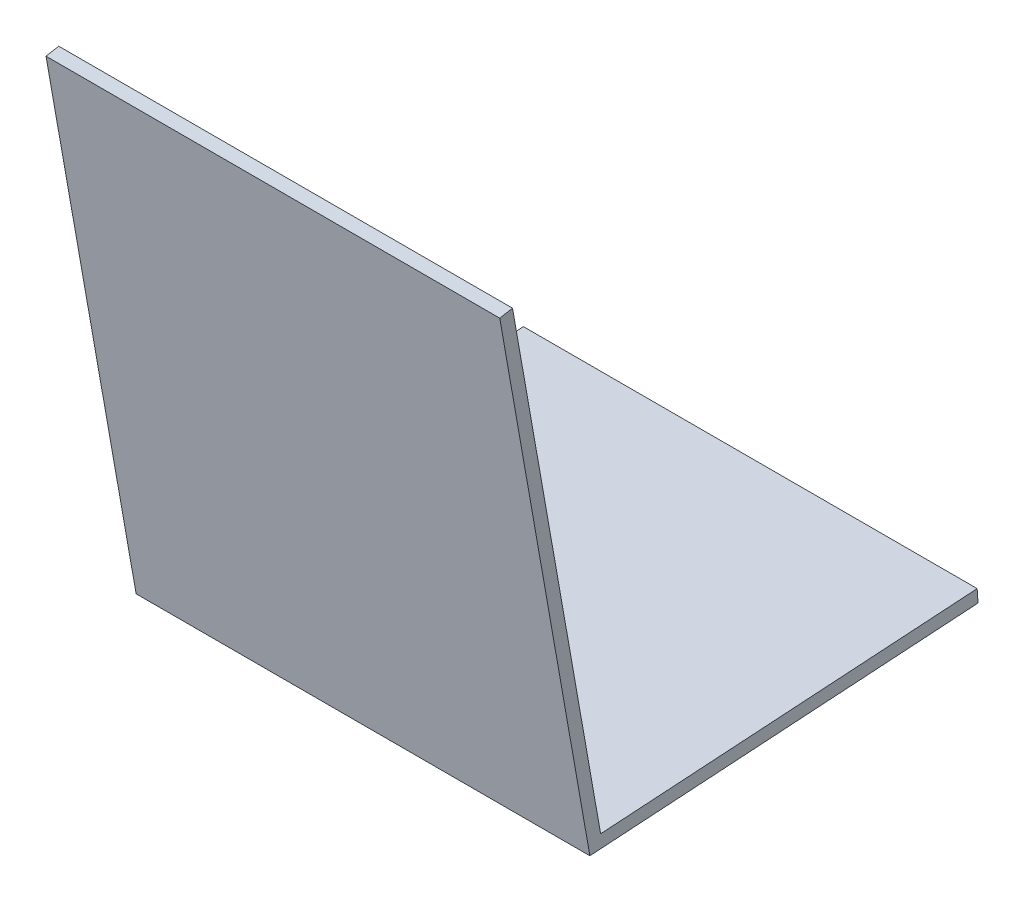
ISO-10303-21;
HEADER;
FILE_DESCRIPTION(('STEP AP214'),'2;1');
FILE_NAME('part.step','',(''),(''),'','','');
FILE_SCHEMA(('AUTOMOTIVE_DESIGN { 1 0 10303 214 1 1 1 1 }'));
ENDSEC;
DATA;
#1=APPLICATION_CONTEXT('core data for automotive mechanical design processes');
#2=APPLICATION_PROTOCOL_DEFINITION('international standard','automotive_design',2000,#1);
#3=PRODUCT_CONTEXT('',#1,'mechanical');
#4=PRODUCT('Part','Part','',(#3));
#5=PRODUCT_RELATED_PRODUCT_CATEGORY('part','',(#4));
#6=PRODUCT_DEFINITION_FORMATION('','',#4);
#7=PRODUCT_DEFINITION_CONTEXT('part definition',#1,'design');
#8=PRODUCT_DEFINITION('design','',#6,#7);
#9=PRODUCT_DEFINITION_SHAPE('','',#8);
#10=(LENGTH_UNIT() NAMED_UNIT(*) SI_UNIT(.MILLI.,.METRE.));
#11=(NAMED_UNIT(*) PLANE_ANGLE_UNIT() SI_UNIT($,.RADIAN.));
#12=(NAMED_UNIT(*) SI_UNIT($,.STERADIAN.) SOLID_ANGLE_UNIT());
#13=UNCERTAINTY_MEASURE_WITH_UNIT(LENGTH_MEASURE(1.E-05),#10,'distance_accuracy_value','');
#14=(GEOMETRIC_REPRESENTATION_CONTEXT(3) GLOBAL_UNCERTAINTY_ASSIGNED_CONTEXT((#13)) GLOBAL_UNIT_ASSIGNED_CONTEXT((#10,
#11,#12)) REPRESENTATION_CONTEXT('',''));
#15=CARTESIAN_POINT('',(0.,0.,0.));
#16=DIRECTION('',(0.,0.,1.));
#17=DIRECTION('',(1.,0.,0.));
#18=AXIS2_PLACEMENT_3D('',#15,#16,#17);
#19=CARTESIAN_POINT('',(175.,406.613423527175,923.912107866843));
#20=DIRECTION('',(0.,-0.984783558817937,-0.173785333909049));
#21=DIRECTION('',(0.,0.173785333909049,-0.984783558817937));
#22=AXIS2_PLACEMENT_3D('',#19,#20,#21);
#23=PLANE('',#22);
#24=DIRECTION('',(0.,-0.173785333909049,0.984783558817937));
#25=VECTOR('',#24,1.);
#26=CARTESIAN_POINT('',(-175.,406.613423527175,923.912107866843));
#27=LINE('',#26,#25);
#28=CARTESIAN_POINT('',(-175.,408.351276866265,914.064272278663));
#29=VERTEX_POINT('',#28);
#30=CARTESIAN_POINT('',(-175.,406.613423527175,923.912107866843));
#31=VERTEX_POINT('',#30);
#32=EDGE_CURVE('E123',#29,#31,#27,.T.);
#33=ORIENTED_EDGE('',*,*,#32,.T.);
#34=DIRECTION('',(-1.,0.,0.));
#35=VECTOR('',#34,1.);
#36=CARTESIAN_POINT('',(175.,406.613423527175,923.912107866843));
#37=LINE('',#36,#35);
#38=CARTESIAN_POINT('',(175.,406.613423527175,923.912107866843));
#39=VERTEX_POINT('',#38);
#40=EDGE_CURVE('E11',#39,#31,#37,.T.);
#41=ORIENTED_EDGE('',*,*,#40,.F.);
#42=DIRECTION('',(0.,-0.173785333909049,0.984783558817937));
#43=VECTOR('',#42,1.);
#44=CARTESIAN_POINT('',(175.,406.613423527175,923.912107866843));
#45=LINE('',#44,#43);
#46=CARTESIAN_POINT('',(175.,408.351276866265,914.064272278663));
#47=VERTEX_POINT('',#46);
#48=EDGE_CURVE('E133',#47,#39,#45,.T.);
#49=ORIENTED_EDGE('',*,*,#48,.F.);
#50=DIRECTION('',(-1.,0.,0.));
#51=VECTOR('',#50,1.);
#52=CARTESIAN_POINT('',(175.,408.351276866265,914.064272278663));
#53=LINE('',#52,#51);
#54=EDGE_CURVE('E119',#47,#29,#53,.T.);
#55=ORIENTED_EDGE('',*,*,#54,.T.);
#56=EDGE_LOOP('',(#33,#41,#49,#55));
#57=FACE_BOUND('',#56,.T.);
#58=ADVANCED_FACE('F39',(#57),#23,.F.);
#59=CARTESIAN_POINT('',(175.,406.613423527175,923.912107866843));
#60=DIRECTION('',(0.,0.173785333909047,-0.984783558817937));
#61=DIRECTION('',(0.,0.984783558817937,0.173785333909048));
#62=AXIS2_PLACEMENT_3D('',#59,#60,#61);
#63=PLANE('',#62);
#64=DIRECTION('',(0.,-0.984783558817937,-0.173785333909048));
#65=VECTOR('',#64,1.);
#66=CARTESIAN_POINT('',(-175.,406.613423527175,923.912107866843));
#67=LINE('',#66,#65);
#68=CARTESIAN_POINT('',(-175.,12.7,854.397974303224));
#69=VERTEX_POINT('',#68);
#70=EDGE_CURVE('E126',#31,#69,#67,.T.);
#71=ORIENTED_EDGE('',*,*,#70,.T.);
#72=DIRECTION('',(-1.,0.,0.));
#73=VECTOR('',#72,1.);
#74=CARTESIAN_POINT('',(175.,12.7,854.397974303224));
#75=LINE('',#74,#73);
#76=CARTESIAN_POINT('',(175.,12.7,854.397974303224));
#77=VERTEX_POINT('',#76);
#78=EDGE_CURVE('E47',#77,#69,#75,.T.);
#79=ORIENTED_EDGE('',*,*,#78,.F.);
#80=DIRECTION('',(0.,-0.984783558817937,-0.173785333909048));
#81=VECTOR('',#80,1.);
#82=CARTESIAN_POINT('',(175.,406.613423527175,923.912107866843));
#83=LINE('',#82,#81);
#84=EDGE_CURVE('E92',#39,#77,#83,.T.);
#85=ORIENTED_EDGE('',*,*,#84,.F.);
#86=ORIENTED_EDGE('',*,*,#40,.T.);
#87=EDGE_LOOP('',(#71,#79,#85,#86));
#88=FACE_BOUND('',#87,.T.);
#89=ADVANCED_FACE('F157',(#88),#63,.F.);
#90=CARTESIAN_POINT('',(175.,12.7,854.397974303224));
#91=DIRECTION('',(0.,0.997962914655115,0.0637967160053498));
#92=DIRECTION('',(0.,-0.0637967160053498,0.997962914655115));
#93=AXIS2_PLACEMENT_3D('',#90,#91,#92);
#94=PLANE('',#93);
#95=DIRECTION('',(0.,0.0637967160053499,-0.997962914655115));
#96=VECTOR('',#95,1.);
#97=CARTESIAN_POINT('',(-175.,12.7,854.397974303224));
#98=LINE('',#97,#96);
#99=CARTESIAN_POINT('',(-175.,31.8390148016049,555.009099906689));
#100=VERTEX_POINT('',#99);
#101=EDGE_CURVE('E128',#69,#100,#98,.T.);
#102=ORIENTED_EDGE('',*,*,#101,.T.);
#103=DIRECTION('',(-1.,0.,0.));
#104=VECTOR('',#103,1.);
#105=CARTESIAN_POINT('',(175.,31.8390148016049,555.009099906689));
#106=LINE('',#105,#104);
#107=CARTESIAN_POINT('',(175.,31.8390148016049,555.009099906689));
#108=VERTEX_POINT('',#107);
#109=EDGE_CURVE('E114',#108,#100,#106,.T.);
#110=ORIENTED_EDGE('',*,*,#109,.F.);
#111=DIRECTION('',(0.,0.0637967160053499,-0.997962914655115));
#112=VECTOR('',#111,1.);
#113=CARTESIAN_POINT('',(175.,12.7,854.397974303224));
#114=LINE('',#113,#112);
#115=EDGE_CURVE('E105',#77,#108,#114,.T.);
#116=ORIENTED_EDGE('',*,*,#115,.F.);
#117=ORIENTED_EDGE('',*,*,#78,.T.);
#118=EDGE_LOOP('',(#102,#110,#116,#117));
#119=FACE_BOUND('',#118,.T.);
#120=ADVANCED_FACE('F139',(#119),#94,.F.);
#121=CARTESIAN_POINT('',(175.,31.8390148016049,555.009099906689));
#122=DIRECTION('',(0.,-0.0637967160053487,0.997962914655115));
#123=DIRECTION('',(0.,-0.997962914655115,-0.0637967160053487));
#124=AXIS2_PLACEMENT_3D('',#121,#122,#123);
#125=PLANE('',#124);
#126=DIRECTION('',(0.,0.997962914655115,0.0637967160053487));
#127=VECTOR('',#126,1.);
#128=CARTESIAN_POINT('',(-175.,31.8390148016049,555.009099906689));
#129=LINE('',#128,#127);
#130=CARTESIAN_POINT('',(-175.,41.8186439481561,555.647067066742));
#131=VERTEX_POINT('',#130);
#132=EDGE_CURVE('E113',#100,#131,#129,.T.);
#133=ORIENTED_EDGE('',*,*,#132,.T.);
#134=DIRECTION('',(-1.,0.,0.));
#135=VECTOR('',#134,1.);
#136=CARTESIAN_POINT('',(175.,41.8186439481561,555.647067066742));
#137=LINE('',#136,#135);
#138=CARTESIAN_POINT('',(175.,41.8186439481561,555.647067066742));
#139=VERTEX_POINT('',#138);
#140=EDGE_CURVE('E110',#139,#131,#137,.T.);
#141=ORIENTED_EDGE('',*,*,#140,.F.);
#142=DIRECTION('',(0.,0.997962914655115,0.0637967160053487));
#143=VECTOR('',#142,1.);
#144=CARTESIAN_POINT('',(175.,31.8390148016049,555.009099906689));
#145=LINE('',#144,#143);
#146=EDGE_CURVE('E99',#108,#139,#145,.T.);
#147=ORIENTED_EDGE('',*,*,#146,.F.);
#148=ORIENTED_EDGE('',*,*,#109,.T.);
#149=EDGE_LOOP('',(#133,#141,#147,#148));
#150=FACE_BOUND('',#149,.T.);
#151=ADVANCED_FACE('F111',(#150),#125,.F.);
#152=CARTESIAN_POINT('',(175.,23.2505365755461,846.105318109713));
#153=DIRECTION('',(0.,-0.997962914655115,-0.0637967160053499));
#154=DIRECTION('',(0.,0.0637967160053499,-0.997962914655115));
#155=AXIS2_PLACEMENT_3D('',#152,#153,#154);
#156=PLANE('',#155);
#157=DIRECTION('',(0.,-0.0637967160053499,0.997962914655115));
#158=VECTOR('',#157,1.);
#159=CARTESIAN_POINT('',(-175.,23.2505365755461,846.105318109713));
#160=LINE('',#159,#158);
#161=CARTESIAN_POINT('',(-175.,23.2505365755461,846.105318109713));
#162=VERTEX_POINT('',#161);
#163=EDGE_CURVE('E78',#131,#162,#160,.T.);
#164=ORIENTED_EDGE('',*,*,#163,.T.);
#165=DIRECTION('',(-1.,0.,0.));
#166=VECTOR('',#165,1.);
#167=CARTESIAN_POINT('',(175.,23.2505365755461,846.105318109713));
#168=LINE('',#167,#166);
#169=CARTESIAN_POINT('',(175.,23.2505365755461,846.105318109713));
#170=VERTEX_POINT('',#169);
#171=EDGE_CURVE('E115',#170,#162,#168,.T.);
#172=ORIENTED_EDGE('',*,*,#171,.F.);
#173=DIRECTION('',(0.,-0.0637967160053499,0.997962914655115));
#174=VECTOR('',#173,1.);
#175=CARTESIAN_POINT('',(175.,23.2505365755461,846.105318109713));
#176=LINE('',#175,#174);
#177=EDGE_CURVE('E103',#139,#170,#176,.T.);
#178=ORIENTED_EDGE('',*,*,#177,.F.);
#179=ORIENTED_EDGE('',*,*,#140,.T.);
#180=EDGE_LOOP('',(#164,#172,#178,#179));
#181=FACE_BOUND('',#180,.T.);
#182=ADVANCED_FACE('F117',(#181),#156,.F.);
#183=CARTESIAN_POINT('',(175.,408.351276866265,914.064272278663));
#184=DIRECTION('',(0.,-0.173785333909048,0.984783558817937));
#185=DIRECTION('',(0.,-0.984783558817937,-0.173785333909048));
#186=AXIS2_PLACEMENT_3D('',#183,#184,#185);
#187=PLANE('',#186);
#188=DIRECTION('',(0.,0.984783558817937,0.173785333909048));
#189=VECTOR('',#188,1.);
#190=CARTESIAN_POINT('',(-175.,408.351276866265,914.064272278663));
#191=LINE('',#190,#189);
#192=EDGE_CURVE('E84',#162,#29,#191,.T.);
#193=ORIENTED_EDGE('',*,*,#192,.T.);
#194=ORIENTED_EDGE('',*,*,#54,.F.);
#195=DIRECTION('',(0.,0.984783558817937,0.173785333909048));
#196=VECTOR('',#195,1.);
#197=CARTESIAN_POINT('',(175.,408.351276866265,914.064272278663));
#198=LINE('',#197,#196);
#199=EDGE_CURVE('E55',#170,#47,#198,.T.);
#200=ORIENTED_EDGE('',*,*,#199,.F.);
#201=ORIENTED_EDGE('',*,*,#171,.T.);
#202=EDGE_LOOP('',(#193,#194,#200,#201));
#203=FACE_BOUND('',#202,.T.);
#204=ADVANCED_FACE('F146',(#203),#187,.F.);
#205=CARTESIAN_POINT('',(175.,0.,0.));
#206=DIRECTION('',(-1.,0.,0.));
#207=DIRECTION('',(0.,0.,1.));
#208=AXIS2_PLACEMENT_3D('',#205,#206,#207);
#209=PLANE('',#208);
#210=ORIENTED_EDGE('',*,*,#48,.T.);
#211=ORIENTED_EDGE('',*,*,#84,.T.);
#212=ORIENTED_EDGE('',*,*,#115,.T.);
#213=ORIENTED_EDGE('',*,*,#146,.T.);
#214=ORIENTED_EDGE('',*,*,#177,.T.);
#215=ORIENTED_EDGE('',*,*,#199,.T.);
#216=EDGE_LOOP('',(#210,#211,#212,#213,#214,#215));
#217=FACE_BOUND('',#216,.T.);
#218=ADVANCED_FACE('F101',(#217),#209,.F.);
#219=CARTESIAN_POINT('',(-175.,0.,0.));
#220=DIRECTION('',(-1.,0.,0.));
#221=DIRECTION('',(0.,0.,1.));
#222=AXIS2_PLACEMENT_3D('',#219,#220,#221);
#223=PLANE('',#222);
#224=ORIENTED_EDGE('',*,*,#32,.F.);
#225=ORIENTED_EDGE('',*,*,#192,.F.);
#226=ORIENTED_EDGE('',*,*,#163,.F.);
#227=ORIENTED_EDGE('',*,*,#132,.F.);
#228=ORIENTED_EDGE('',*,*,#101,.F.);
#229=ORIENTED_EDGE('',*,*,#70,.F.);
#230=EDGE_LOOP('',(#224,#225,#226,#227,#228,#229));
#231=FACE_BOUND('',#230,.T.);
#232=ADVANCED_FACE('F142',(#231),#223,.T.);
#233=CLOSED_SHELL('',(#58,#89,#120,#151,#182,#204,#218,#232));
#234=MANIFOLD_SOLID_BREP('B2',#233);
#235=ADVANCED_BREP_SHAPE_REPRESENTATION('',(#18,#234),#14);
#236=SHAPE_DEFINITION_REPRESENTATION(#9,#235);
ENDSEC;
END-ISO-10303-21;
